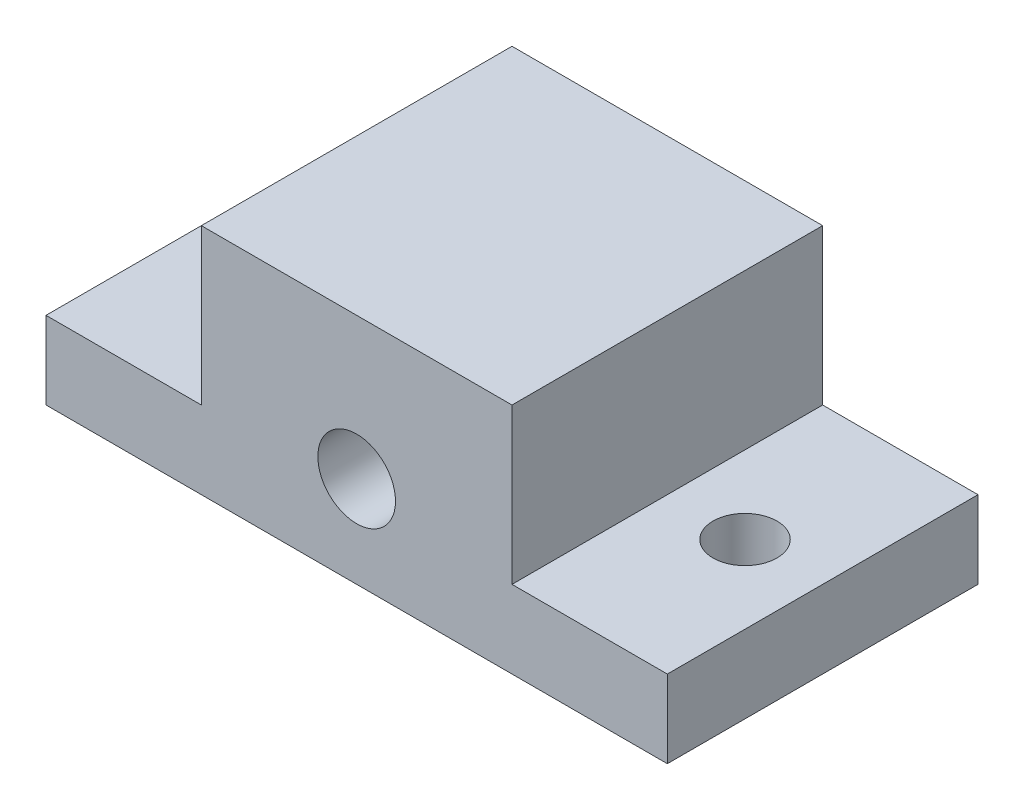
ISO-10303-21;
HEADER;
FILE_DESCRIPTION(('STEP AP214'),'2;1');
FILE_NAME('part.step','',(''),(''),'','','');
FILE_SCHEMA(('AUTOMOTIVE_DESIGN { 1 0 10303 214 1 1 1 1 }'));
ENDSEC;
DATA;
#1=APPLICATION_CONTEXT('core data for automotive mechanical design processes');
#2=APPLICATION_PROTOCOL_DEFINITION('international standard','automotive_design',2000,#1);
#3=PRODUCT_CONTEXT('',#1,'mechanical');
#4=PRODUCT('Part','Part','',(#3));
#5=PRODUCT_RELATED_PRODUCT_CATEGORY('part','',(#4));
#6=PRODUCT_DEFINITION_FORMATION('','',#4);
#7=PRODUCT_DEFINITION_CONTEXT('part definition',#1,'design');
#8=PRODUCT_DEFINITION('design','',#6,#7);
#9=PRODUCT_DEFINITION_SHAPE('','',#8);
#10=(LENGTH_UNIT() NAMED_UNIT(*) SI_UNIT(.MILLI.,.METRE.));
#11=(NAMED_UNIT(*) PLANE_ANGLE_UNIT() SI_UNIT($,.RADIAN.));
#12=(NAMED_UNIT(*) SI_UNIT($,.STERADIAN.) SOLID_ANGLE_UNIT());
#13=UNCERTAINTY_MEASURE_WITH_UNIT(LENGTH_MEASURE(1.E-05),#10,'distance_accuracy_value','');
#14=(GEOMETRIC_REPRESENTATION_CONTEXT(3) GLOBAL_UNCERTAINTY_ASSIGNED_CONTEXT((#13)) GLOBAL_UNIT_ASSIGNED_CONTEXT((#10,
#11,#12)) REPRESENTATION_CONTEXT('',''));
#15=CARTESIAN_POINT('',(0.,0.,0.));
#16=DIRECTION('',(0.,0.,1.));
#17=DIRECTION('',(1.,0.,0.));
#18=AXIS2_PLACEMENT_3D('',#15,#16,#17);
#19=CARTESIAN_POINT('',(12.7,4.7625,12.7));
#20=DIRECTION('',(-1.,0.,0.));
#21=DIRECTION('',(0.,-1.,0.));
#22=AXIS2_PLACEMENT_3D('',#19,#20,#21);
#23=PLANE('',#22);
#24=DIRECTION('',(0.,1.,0.));
#25=VECTOR('',#24,1.);
#26=CARTESIAN_POINT('',(12.7,4.7625,0.));
#27=LINE('',#26,#25);
#28=CARTESIAN_POINT('',(12.7,-4.7625,0.));
#29=VERTEX_POINT('',#28);
#30=CARTESIAN_POINT('',(12.7,-1.5875,0.));
#31=VERTEX_POINT('',#30);
#32=EDGE_CURVE('E126',#29,#31,#27,.T.);
#33=ORIENTED_EDGE('',*,*,#32,.T.);
#34=DIRECTION('',(0.,0.,1.));
#35=VECTOR('',#34,1.);
#36=CARTESIAN_POINT('',(12.7,-1.5875,0.));
#37=LINE('',#36,#35);
#38=CARTESIAN_POINT('',(12.7,-1.5875,12.7));
#39=VERTEX_POINT('',#38);
#40=EDGE_CURVE('E182',#31,#39,#37,.T.);
#41=ORIENTED_EDGE('',*,*,#40,.T.);
#42=DIRECTION('',(0.,1.,0.));
#43=VECTOR('',#42,1.);
#44=CARTESIAN_POINT('',(12.7,4.7625,12.7));
#45=LINE('',#44,#43);
#46=CARTESIAN_POINT('',(12.7,-4.7625,12.7));
#47=VERTEX_POINT('',#46);
#48=EDGE_CURVE('E123',#47,#39,#45,.T.);
#49=ORIENTED_EDGE('',*,*,#48,.F.);
#50=DIRECTION('',(0.,0.,-1.));
#51=VECTOR('',#50,1.);
#52=CARTESIAN_POINT('',(12.7,-4.7625,12.7));
#53=LINE('',#52,#51);
#54=EDGE_CURVE('E42',#47,#29,#53,.T.);
#55=ORIENTED_EDGE('',*,*,#54,.T.);
#56=EDGE_LOOP('',(#33,#41,#49,#55));
#57=FACE_BOUND('',#56,.T.);
#58=ADVANCED_FACE('F35',(#57),#23,.F.);
#59=CARTESIAN_POINT('',(-12.7,4.7625,12.7));
#60=DIRECTION('',(0.,-1.,0.));
#61=DIRECTION('',(0.,0.,-1.));
#62=AXIS2_PLACEMENT_3D('',#59,#60,#61);
#63=PLANE('',#62);
#64=DIRECTION('',(-1.,0.,0.));
#65=VECTOR('',#64,1.);
#66=CARTESIAN_POINT('',(-12.7,4.7625,12.7));
#67=LINE('',#66,#65);
#68=CARTESIAN_POINT('',(6.35,4.7625,12.7));
#69=VERTEX_POINT('',#68);
#70=CARTESIAN_POINT('',(-6.35,4.7625,12.7));
#71=VERTEX_POINT('',#70);
#72=EDGE_CURVE('E139',#69,#71,#67,.T.);
#73=ORIENTED_EDGE('',*,*,#72,.F.);
#74=DIRECTION('',(0.,0.,1.));
#75=VECTOR('',#74,1.);
#76=CARTESIAN_POINT('',(6.35,4.7625,0.));
#77=LINE('',#76,#75);
#78=CARTESIAN_POINT('',(6.35,4.7625,0.));
#79=VERTEX_POINT('',#78);
#80=EDGE_CURVE('E153',#79,#69,#77,.T.);
#81=ORIENTED_EDGE('',*,*,#80,.F.);
#82=DIRECTION('',(-1.,0.,0.));
#83=VECTOR('',#82,1.);
#84=CARTESIAN_POINT('',(-12.7,4.7625,0.));
#85=LINE('',#84,#83);
#86=CARTESIAN_POINT('',(-6.35,4.7625,0.));
#87=VERTEX_POINT('',#86);
#88=EDGE_CURVE('E121',#79,#87,#85,.T.);
#89=ORIENTED_EDGE('',*,*,#88,.T.);
#90=DIRECTION('',(0.,0.,1.));
#91=VECTOR('',#90,1.);
#92=CARTESIAN_POINT('',(-6.35,4.7625,0.));
#93=LINE('',#92,#91);
#94=EDGE_CURVE('E150',#87,#71,#93,.T.);
#95=ORIENTED_EDGE('',*,*,#94,.T.);
#96=EDGE_LOOP('',(#73,#81,#89,#95));
#97=FACE_BOUND('',#96,.T.);
#98=ADVANCED_FACE('F168',(#97),#63,.F.);
#99=CARTESIAN_POINT('',(-12.7,4.7625,12.7));
#100=DIRECTION('',(1.,0.,0.));
#101=DIRECTION('',(0.,1.,0.));
#102=AXIS2_PLACEMENT_3D('',#99,#100,#101);
#103=PLANE('',#102);
#104=DIRECTION('',(0.,-1.,0.));
#105=VECTOR('',#104,1.);
#106=CARTESIAN_POINT('',(-12.7,4.7625,12.7));
#107=LINE('',#106,#105);
#108=CARTESIAN_POINT('',(-12.7,-1.5875,12.7));
#109=VERTEX_POINT('',#108);
#110=CARTESIAN_POINT('',(-12.7,-4.7625,12.7));
#111=VERTEX_POINT('',#110);
#112=EDGE_CURVE('E114',#109,#111,#107,.T.);
#113=ORIENTED_EDGE('',*,*,#112,.F.);
#114=DIRECTION('',(0.,0.,1.));
#115=VECTOR('',#114,1.);
#116=CARTESIAN_POINT('',(-12.7,-1.5875,0.));
#117=LINE('',#116,#115);
#118=CARTESIAN_POINT('',(-12.7,-1.5875,0.));
#119=VERTEX_POINT('',#118);
#120=EDGE_CURVE('E102',#119,#109,#117,.T.);
#121=ORIENTED_EDGE('',*,*,#120,.F.);
#122=DIRECTION('',(0.,-1.,0.));
#123=VECTOR('',#122,1.);
#124=CARTESIAN_POINT('',(-12.7,4.7625,0.));
#125=LINE('',#124,#123);
#126=CARTESIAN_POINT('',(-12.7,-4.7625,0.));
#127=VERTEX_POINT('',#126);
#128=EDGE_CURVE('E113',#119,#127,#125,.T.);
#129=ORIENTED_EDGE('',*,*,#128,.T.);
#130=DIRECTION('',(0.,0.,-1.));
#131=VECTOR('',#130,1.);
#132=CARTESIAN_POINT('',(-12.7,-4.7625,12.7));
#133=LINE('',#132,#131);
#134=EDGE_CURVE('E11',#111,#127,#133,.T.);
#135=ORIENTED_EDGE('',*,*,#134,.F.);
#136=EDGE_LOOP('',(#113,#121,#129,#135));
#137=FACE_BOUND('',#136,.T.);
#138=ADVANCED_FACE('F111',(#137),#103,.F.);
#139=CARTESIAN_POINT('',(-12.7,-4.7625,12.7));
#140=DIRECTION('',(0.,1.,0.));
#141=DIRECTION('',(0.,0.,1.));
#142=AXIS2_PLACEMENT_3D('',#139,#140,#141);
#143=PLANE('',#142);
#144=CARTESIAN_POINT('',(9.525,-4.7625,6.35));
#145=DIRECTION('',(0.,1.,0.));
#146=DIRECTION('',(-1.,0.,0.));
#147=AXIS2_PLACEMENT_3D('',#144,#145,#146);
#148=CIRCLE('',#147,1.30879000839959);
#149=CARTESIAN_POINT('',(8.21620999160041,-4.7625,6.35));
#150=VERTEX_POINT('',#149);
#151=EDGE_CURVE('E180',#150,#150,#148,.T.);
#152=ORIENTED_EDGE('',*,*,#151,.T.);
#153=EDGE_LOOP('',(#152));
#154=FACE_BOUND('',#153,.T.);
#155=CARTESIAN_POINT('',(-9.525,-4.7625,6.35));
#156=DIRECTION('',(0.,1.,0.));
#157=DIRECTION('',(-1.,0.,0.));
#158=AXIS2_PLACEMENT_3D('',#155,#156,#157);
#159=CIRCLE('',#158,1.30879000839959);
#160=CARTESIAN_POINT('',(-10.8337900083996,-4.7625,6.35));
#161=VERTEX_POINT('',#160);
#162=EDGE_CURVE('E231',#161,#161,#159,.T.);
#163=ORIENTED_EDGE('',*,*,#162,.T.);
#164=EDGE_LOOP('',(#163));
#165=FACE_BOUND('',#164,.T.);
#166=DIRECTION('',(1.,0.,0.));
#167=VECTOR('',#166,1.);
#168=CARTESIAN_POINT('',(-12.7,-4.7625,0.));
#169=LINE('',#168,#167);
#170=EDGE_CURVE('E120',#127,#29,#169,.T.);
#171=ORIENTED_EDGE('',*,*,#170,.T.);
#172=ORIENTED_EDGE('',*,*,#54,.F.);
#173=DIRECTION('',(1.,0.,0.));
#174=VECTOR('',#173,1.);
#175=CARTESIAN_POINT('',(-12.7,-4.7625,12.7));
#176=LINE('',#175,#174);
#177=EDGE_CURVE('E130',#111,#47,#176,.T.);
#178=ORIENTED_EDGE('',*,*,#177,.F.);
#179=ORIENTED_EDGE('',*,*,#134,.T.);
#180=EDGE_LOOP('',(#171,#172,#178,#179));
#181=FACE_BOUND('',#180,.T.);
#182=ADVANCED_FACE('F210',(#154,#165,#181),#143,.F.);
#183=CARTESIAN_POINT('',(0.,0.,12.7));
#184=DIRECTION('',(0.,0.,1.));
#185=DIRECTION('',(1.,0.,0.));
#186=AXIS2_PLACEMENT_3D('',#183,#184,#185);
#187=PLANE('',#186);
#188=DIRECTION('',(1.,0.,0.));
#189=VECTOR('',#188,1.);
#190=CARTESIAN_POINT('',(12.7,-1.5875,12.7));
#191=LINE('',#190,#189);
#192=CARTESIAN_POINT('',(6.35,-1.5875,12.7));
#193=VERTEX_POINT('',#192);
#194=EDGE_CURVE('E177',#193,#39,#191,.T.);
#195=ORIENTED_EDGE('',*,*,#194,.F.);
#196=DIRECTION('',(0.,-1.,0.));
#197=VECTOR('',#196,1.);
#198=CARTESIAN_POINT('',(6.35,4.7625,12.7));
#199=LINE('',#198,#197);
#200=EDGE_CURVE('E164',#69,#193,#199,.T.);
#201=ORIENTED_EDGE('',*,*,#200,.F.);
#202=ORIENTED_EDGE('',*,*,#72,.T.);
#203=DIRECTION('',(0.,1.,0.));
#204=VECTOR('',#203,1.);
#205=CARTESIAN_POINT('',(-6.35,4.7625,12.7));
#206=LINE('',#205,#204);
#207=CARTESIAN_POINT('',(-6.35,-1.5875,12.7));
#208=VERTEX_POINT('',#207);
#209=EDGE_CURVE('E107',#208,#71,#206,.T.);
#210=ORIENTED_EDGE('',*,*,#209,.F.);
#211=DIRECTION('',(1.,0.,0.));
#212=VECTOR('',#211,1.);
#213=CARTESIAN_POINT('',(-12.7,-1.5875,12.7));
#214=LINE('',#213,#212);
#215=EDGE_CURVE('E183',#109,#208,#214,.T.);
#216=ORIENTED_EDGE('',*,*,#215,.F.);
#217=ORIENTED_EDGE('',*,*,#112,.T.);
#218=ORIENTED_EDGE('',*,*,#177,.T.);
#219=ORIENTED_EDGE('',*,*,#48,.T.);
#220=EDGE_LOOP('',(#195,#201,#202,#210,#216,#217,#218,#219));
#221=FACE_BOUND('',#220,.T.);
#222=CARTESIAN_POINT('',(0.,-1.0287,12.7));
#223=DIRECTION('',(0.,0.,1.));
#224=DIRECTION('',(1.,0.,0.));
#225=AXIS2_PLACEMENT_3D('',#222,#223,#224);
#226=CIRCLE('',#225,1.5875);
#227=CARTESIAN_POINT('',(1.5875,-1.0287,12.7));
#228=VERTEX_POINT('',#227);
#229=EDGE_CURVE('E145',#228,#228,#226,.T.);
#230=ORIENTED_EDGE('',*,*,#229,.F.);
#231=EDGE_LOOP('',(#230));
#232=FACE_BOUND('',#231,.T.);
#233=ADVANCED_FACE('F161',(#221,#232),#187,.T.);
#234=CARTESIAN_POINT('',(0.,0.,0.));
#235=DIRECTION('',(0.,0.,1.));
#236=DIRECTION('',(1.,0.,0.));
#237=AXIS2_PLACEMENT_3D('',#234,#235,#236);
#238=PLANE('',#237);
#239=CARTESIAN_POINT('',(0.,-1.0287,0.));
#240=DIRECTION('',(0.,0.,1.));
#241=DIRECTION('',(1.,0.,0.));
#242=AXIS2_PLACEMENT_3D('',#239,#240,#241);
#243=CIRCLE('',#242,1.5875);
#244=CARTESIAN_POINT('',(1.5875,-1.0287,0.));
#245=VERTEX_POINT('',#244);
#246=EDGE_CURVE('E142',#245,#245,#243,.T.);
#247=ORIENTED_EDGE('',*,*,#246,.T.);
#248=EDGE_LOOP('',(#247));
#249=FACE_BOUND('',#248,.T.);
#250=DIRECTION('',(0.,-1.,0.));
#251=VECTOR('',#250,1.);
#252=CARTESIAN_POINT('',(6.35,4.7625,0.));
#253=LINE('',#252,#251);
#254=CARTESIAN_POINT('',(6.35,-1.5875,0.));
#255=VERTEX_POINT('',#254);
#256=EDGE_CURVE('E175',#79,#255,#253,.T.);
#257=ORIENTED_EDGE('',*,*,#256,.T.);
#258=DIRECTION('',(1.,0.,0.));
#259=VECTOR('',#258,1.);
#260=CARTESIAN_POINT('',(12.7,-1.5875,0.));
#261=LINE('',#260,#259);
#262=EDGE_CURVE('E49',#255,#31,#261,.T.);
#263=ORIENTED_EDGE('',*,*,#262,.T.);
#264=ORIENTED_EDGE('',*,*,#32,.F.);
#265=ORIENTED_EDGE('',*,*,#170,.F.);
#266=ORIENTED_EDGE('',*,*,#128,.F.);
#267=DIRECTION('',(1.,0.,0.));
#268=VECTOR('',#267,1.);
#269=CARTESIAN_POINT('',(-12.7,-1.5875,0.));
#270=LINE('',#269,#268);
#271=CARTESIAN_POINT('',(-6.35,-1.5875,0.));
#272=VERTEX_POINT('',#271);
#273=EDGE_CURVE('E98',#119,#272,#270,.T.);
#274=ORIENTED_EDGE('',*,*,#273,.T.);
#275=DIRECTION('',(0.,1.,0.));
#276=VECTOR('',#275,1.);
#277=CARTESIAN_POINT('',(-6.35,4.7625,0.));
#278=LINE('',#277,#276);
#279=EDGE_CURVE('E57',#272,#87,#278,.T.);
#280=ORIENTED_EDGE('',*,*,#279,.T.);
#281=ORIENTED_EDGE('',*,*,#88,.F.);
#282=EDGE_LOOP('',(#257,#263,#264,#265,#266,#274,#280,#281));
#283=FACE_BOUND('',#282,.T.);
#284=ADVANCED_FACE('F118',(#249,#283),#238,.F.);
#285=CARTESIAN_POINT('',(0.,-1.0287,0.));
#286=DIRECTION('',(0.,0.,1.));
#287=DIRECTION('',(1.,0.,0.));
#288=AXIS2_PLACEMENT_3D('',#285,#286,#287);
#289=CYLINDRICAL_SURFACE('',#288,1.5875);
#290=ORIENTED_EDGE('',*,*,#246,.F.);
#291=EDGE_LOOP('',(#290));
#292=FACE_BOUND('',#291,.T.);
#293=ORIENTED_EDGE('',*,*,#229,.T.);
#294=EDGE_LOOP('',(#293));
#295=FACE_BOUND('',#294,.T.);
#296=ADVANCED_FACE('F191',(#292,#295),#289,.F.);
#297=CARTESIAN_POINT('',(-6.35,4.7625,0.));
#298=DIRECTION('',(1.,0.,0.));
#299=DIRECTION('',(0.,1.,0.));
#300=AXIS2_PLACEMENT_3D('',#297,#298,#299);
#301=PLANE('',#300);
#302=ORIENTED_EDGE('',*,*,#209,.T.);
#303=ORIENTED_EDGE('',*,*,#94,.F.);
#304=ORIENTED_EDGE('',*,*,#279,.F.);
#305=DIRECTION('',(0.,0.,1.));
#306=VECTOR('',#305,1.);
#307=CARTESIAN_POINT('',(-6.35,-1.5875,0.));
#308=LINE('',#307,#306);
#309=EDGE_CURVE('E104',#272,#208,#308,.T.);
#310=ORIENTED_EDGE('',*,*,#309,.T.);
#311=EDGE_LOOP('',(#302,#303,#304,#310));
#312=FACE_BOUND('',#311,.T.);
#313=ADVANCED_FACE('F189',(#312),#301,.F.);
#314=CARTESIAN_POINT('',(-12.7,-1.5875,0.));
#315=DIRECTION('',(0.,-1.,0.));
#316=DIRECTION('',(0.,0.,-1.));
#317=AXIS2_PLACEMENT_3D('',#314,#315,#316);
#318=PLANE('',#317);
#319=CARTESIAN_POINT('',(-9.525,-1.5875,6.35));
#320=DIRECTION('',(0.,1.,0.));
#321=DIRECTION('',(-1.,0.,0.));
#322=AXIS2_PLACEMENT_3D('',#319,#320,#321);
#323=CIRCLE('',#322,1.30879000839959);
#324=CARTESIAN_POINT('',(-10.8337900083996,-1.5875,6.35));
#325=VERTEX_POINT('',#324);
#326=EDGE_CURVE('E236',#325,#325,#323,.T.);
#327=ORIENTED_EDGE('',*,*,#326,.F.);
#328=EDGE_LOOP('',(#327));
#329=FACE_BOUND('',#328,.T.);
#330=ORIENTED_EDGE('',*,*,#215,.T.);
#331=ORIENTED_EDGE('',*,*,#309,.F.);
#332=ORIENTED_EDGE('',*,*,#273,.F.);
#333=ORIENTED_EDGE('',*,*,#120,.T.);
#334=EDGE_LOOP('',(#330,#331,#332,#333));
#335=FACE_BOUND('',#334,.T.);
#336=ADVANCED_FACE('F101',(#329,#335),#318,.F.);
#337=CARTESIAN_POINT('',(12.7,-1.5875,0.));
#338=DIRECTION('',(0.,-1.,0.));
#339=DIRECTION('',(1.,0.,0.));
#340=AXIS2_PLACEMENT_3D('',#337,#338,#339);
#341=PLANE('',#340);
#342=CARTESIAN_POINT('',(9.525,-1.5875,6.35));
#343=DIRECTION('',(0.,1.,0.));
#344=DIRECTION('',(-1.,0.,0.));
#345=AXIS2_PLACEMENT_3D('',#342,#343,#344);
#346=CIRCLE('',#345,1.30879000839959);
#347=CARTESIAN_POINT('',(8.21620999160041,-1.5875,6.35));
#348=VERTEX_POINT('',#347);
#349=EDGE_CURVE('E229',#348,#348,#346,.T.);
#350=ORIENTED_EDGE('',*,*,#349,.F.);
#351=EDGE_LOOP('',(#350));
#352=FACE_BOUND('',#351,.T.);
#353=ORIENTED_EDGE('',*,*,#194,.T.);
#354=ORIENTED_EDGE('',*,*,#40,.F.);
#355=ORIENTED_EDGE('',*,*,#262,.F.);
#356=DIRECTION('',(0.,0.,1.));
#357=VECTOR('',#356,1.);
#358=CARTESIAN_POINT('',(6.35,-1.5875,0.));
#359=LINE('',#358,#357);
#360=EDGE_CURVE('E184',#255,#193,#359,.T.);
#361=ORIENTED_EDGE('',*,*,#360,.T.);
#362=EDGE_LOOP('',(#353,#354,#355,#361));
#363=FACE_BOUND('',#362,.T.);
#364=ADVANCED_FACE('F197',(#352,#363),#341,.F.);
#365=CARTESIAN_POINT('',(6.35,4.7625,0.));
#366=DIRECTION('',(-1.,0.,0.));
#367=DIRECTION('',(0.,-1.,0.));
#368=AXIS2_PLACEMENT_3D('',#365,#366,#367);
#369=PLANE('',#368);
#370=ORIENTED_EDGE('',*,*,#200,.T.);
#371=ORIENTED_EDGE('',*,*,#360,.F.);
#372=ORIENTED_EDGE('',*,*,#256,.F.);
#373=ORIENTED_EDGE('',*,*,#80,.T.);
#374=EDGE_LOOP('',(#370,#371,#372,#373));
#375=FACE_BOUND('',#374,.T.);
#376=ADVANCED_FACE('F186',(#375),#369,.F.);
#377=CARTESIAN_POINT('',(9.525,-4.7625,6.35));
#378=DIRECTION('',(0.,1.,0.));
#379=DIRECTION('',(-1.,0.,0.));
#380=AXIS2_PLACEMENT_3D('',#377,#378,#379);
#381=CYLINDRICAL_SURFACE('',#380,1.30879000839959);
#382=ORIENTED_EDGE('',*,*,#151,.F.);
#383=EDGE_LOOP('',(#382));
#384=FACE_BOUND('',#383,.T.);
#385=ORIENTED_EDGE('',*,*,#349,.T.);
#386=EDGE_LOOP('',(#385));
#387=FACE_BOUND('',#386,.T.);
#388=ADVANCED_FACE('F222',(#384,#387),#381,.F.);
#389=CARTESIAN_POINT('',(-9.525,-4.7625,6.35));
#390=DIRECTION('',(0.,1.,0.));
#391=DIRECTION('',(-1.,0.,0.));
#392=AXIS2_PLACEMENT_3D('',#389,#390,#391);
#393=CYLINDRICAL_SURFACE('',#392,1.30879000839959);
#394=ORIENTED_EDGE('',*,*,#162,.F.);
#395=EDGE_LOOP('',(#394));
#396=FACE_BOUND('',#395,.T.);
#397=ORIENTED_EDGE('',*,*,#326,.T.);
#398=EDGE_LOOP('',(#397));
#399=FACE_BOUND('',#398,.T.);
#400=ADVANCED_FACE('F241',(#396,#399),#393,.F.);
#401=CLOSED_SHELL('',(#58,#98,#138,#182,#233,#284,#296,#313,#336,#364,#376,#388,#400));
#402=MANIFOLD_SOLID_BREP('B2',#401);
#403=ADVANCED_BREP_SHAPE_REPRESENTATION('',(#18,#402),#14);
#404=SHAPE_DEFINITION_REPRESENTATION(#9,#403);
ENDSEC;
END-ISO-10303-21;
